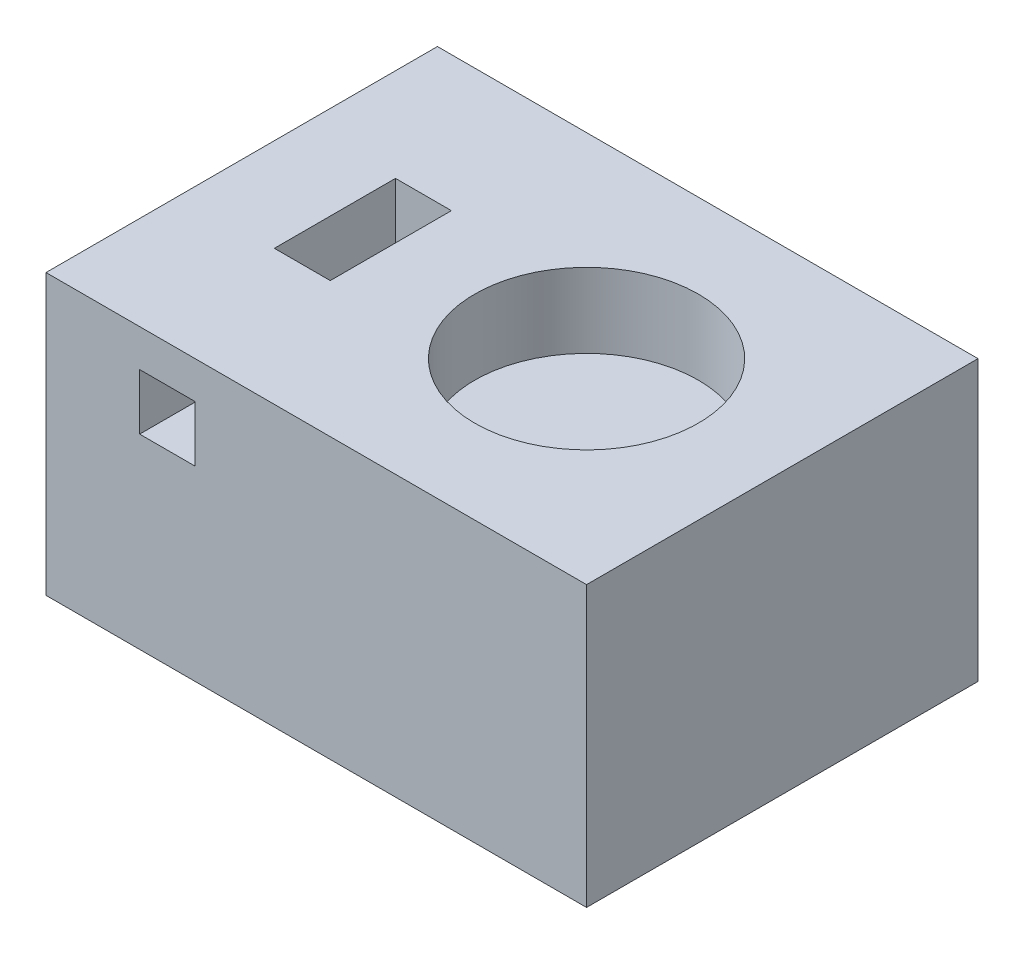
ISO-10303-21;
HEADER;
FILE_DESCRIPTION(('STEP AP214'),'2;1');
FILE_NAME('part.step','',(''),(''),'','','');
FILE_SCHEMA(('AUTOMOTIVE_DESIGN { 1 0 10303 214 1 1 1 1 }'));
ENDSEC;
DATA;
#1=APPLICATION_CONTEXT('core data for automotive mechanical design processes');
#2=APPLICATION_PROTOCOL_DEFINITION('international standard','automotive_design',2000,#1);
#3=PRODUCT_CONTEXT('',#1,'mechanical');
#4=PRODUCT('Part','Part','',(#3));
#5=PRODUCT_RELATED_PRODUCT_CATEGORY('part','',(#4));
#6=PRODUCT_DEFINITION_FORMATION('','',#4);
#7=PRODUCT_DEFINITION_CONTEXT('part definition',#1,'design');
#8=PRODUCT_DEFINITION('design','',#6,#7);
#9=PRODUCT_DEFINITION_SHAPE('','',#8);
#10=(LENGTH_UNIT() NAMED_UNIT(*) SI_UNIT(.MILLI.,.METRE.));
#11=(NAMED_UNIT(*) PLANE_ANGLE_UNIT() SI_UNIT($,.RADIAN.));
#12=(NAMED_UNIT(*) SI_UNIT($,.STERADIAN.) SOLID_ANGLE_UNIT());
#13=UNCERTAINTY_MEASURE_WITH_UNIT(LENGTH_MEASURE(1.E-05),#10,'distance_accuracy_value','');
#14=(GEOMETRIC_REPRESENTATION_CONTEXT(3) GLOBAL_UNCERTAINTY_ASSIGNED_CONTEXT((#13)) GLOBAL_UNIT_ASSIGNED_CONTEXT((#10,
#11,#12)) REPRESENTATION_CONTEXT('',''));
#15=CARTESIAN_POINT('',(0.,0.,0.));
#16=DIRECTION('',(0.,0.,1.));
#17=DIRECTION('',(1.,0.,0.));
#18=AXIS2_PLACEMENT_3D('',#15,#16,#17);
#19=CARTESIAN_POINT('',(-21.,30.,21.));
#20=DIRECTION('',(0.,0.,-1.));
#21=DIRECTION('',(-1.,0.,0.));
#22=AXIS2_PLACEMENT_3D('',#19,#20,#21);
#23=PLANE('',#22);
#24=DIRECTION('',(1.,0.,0.));
#25=VECTOR('',#24,1.);
#26=CARTESIAN_POINT('',(-21.,0.,21.));
#27=LINE('',#26,#25);
#28=CARTESIAN_POINT('',(-37.,0.,21.));
#29=VERTEX_POINT('',#28);
#30=CARTESIAN_POINT('',(21.,0.,21.));
#31=VERTEX_POINT('',#30);
#32=EDGE_CURVE('E209',#29,#31,#27,.T.);
#33=ORIENTED_EDGE('',*,*,#32,.T.);
#34=DIRECTION('',(0.,-1.,0.));
#35=VECTOR('',#34,1.);
#36=CARTESIAN_POINT('',(21.,30.,21.));
#37=LINE('',#36,#35);
#38=CARTESIAN_POINT('',(21.,30.,21.));
#39=VERTEX_POINT('',#38);
#40=EDGE_CURVE('E213',#39,#31,#37,.T.);
#41=ORIENTED_EDGE('',*,*,#40,.F.);
#42=DIRECTION('',(1.,0.,0.));
#43=VECTOR('',#42,1.);
#44=CARTESIAN_POINT('',(-21.,30.,21.));
#45=LINE('',#44,#43);
#46=CARTESIAN_POINT('',(-37.,30.,21.));
#47=VERTEX_POINT('',#46);
#48=EDGE_CURVE('E211',#47,#39,#45,.T.);
#49=ORIENTED_EDGE('',*,*,#48,.F.);
#50=DIRECTION('',(0.,1.,0.));
#51=VECTOR('',#50,1.);
#52=CARTESIAN_POINT('',(-37.,30.,21.));
#53=LINE('',#52,#51);
#54=EDGE_CURVE('E192',#29,#47,#53,.T.);
#55=ORIENTED_EDGE('',*,*,#54,.F.);
#56=EDGE_LOOP('',(#33,#41,#49,#55));
#57=FACE_BOUND('',#56,.T.);
#58=DIRECTION('',(0.,-1.,0.));
#59=VECTOR('',#58,1.);
#60=CARTESIAN_POINT('',(-26.9493798110874,20.00915587614,21.));
#61=LINE('',#60,#59);
#62=CARTESIAN_POINT('',(-26.9493798110874,26.00915587614,21.));
#63=VERTEX_POINT('',#62);
#64=CARTESIAN_POINT('',(-26.9493798110874,20.00915587614,21.));
#65=VERTEX_POINT('',#64);
#66=EDGE_CURVE('E126',#63,#65,#61,.T.);
#67=ORIENTED_EDGE('',*,*,#66,.F.);
#68=DIRECTION('',(-1.,0.,0.));
#69=VECTOR('',#68,1.);
#70=CARTESIAN_POINT('',(-26.9493798110874,26.00915587614,21.));
#71=LINE('',#70,#69);
#72=CARTESIAN_POINT('',(-21.,26.00915587614,21.));
#73=VERTEX_POINT('',#72);
#74=EDGE_CURVE('E146',#73,#63,#71,.T.);
#75=ORIENTED_EDGE('',*,*,#74,.F.);
#76=DIRECTION('',(0.,1.,0.));
#77=VECTOR('',#76,1.);
#78=CARTESIAN_POINT('',(-21.,20.00915587614,21.));
#79=LINE('',#78,#77);
#80=CARTESIAN_POINT('',(-21.,20.00915587614,21.));
#81=VERTEX_POINT('',#80);
#82=EDGE_CURVE('E144',#81,#73,#79,.T.);
#83=ORIENTED_EDGE('',*,*,#82,.F.);
#84=DIRECTION('',(1.,0.,0.));
#85=VECTOR('',#84,1.);
#86=CARTESIAN_POINT('',(-26.9493798110874,20.00915587614,21.));
#87=LINE('',#86,#85);
#88=EDGE_CURVE('E134',#65,#81,#87,.T.);
#89=ORIENTED_EDGE('',*,*,#88,.F.);
#90=EDGE_LOOP('',(#67,#75,#83,#89));
#91=FACE_BOUND('',#90,.T.);
#92=ADVANCED_FACE('F39',(#57,#91),#23,.F.);
#93=CARTESIAN_POINT('',(-27.,19.,6.5));
#94=DIRECTION('',(0.,0.,1.));
#95=DIRECTION('',(1.,0.,0.));
#96=AXIS2_PLACEMENT_3D('',#93,#94,#95);
#97=PLANE('',#96);
#98=DIRECTION('',(-1.,0.,0.));
#99=VECTOR('',#98,1.);
#100=CARTESIAN_POINT('',(-27.,20.00915587614,6.5));
#101=LINE('',#100,#99);
#102=CARTESIAN_POINT('',(-21.,20.00915587614,6.5));
#103=VERTEX_POINT('',#102);
#104=CARTESIAN_POINT('',(-26.9493798110874,20.00915587614,6.5));
#105=VERTEX_POINT('',#104);
#106=EDGE_CURVE('E11',#103,#105,#101,.T.);
#107=ORIENTED_EDGE('',*,*,#106,.F.);
#108=DIRECTION('',(0.,1.,0.));
#109=VECTOR('',#108,1.);
#110=CARTESIAN_POINT('',(-21.,19.,6.5));
#111=LINE('',#110,#109);
#112=CARTESIAN_POINT('',(-21.,19.,6.5));
#113=VERTEX_POINT('',#112);
#114=EDGE_CURVE('E181',#113,#103,#111,.T.);
#115=ORIENTED_EDGE('',*,*,#114,.F.);
#116=DIRECTION('',(1.,0.,0.));
#117=VECTOR('',#116,1.);
#118=CARTESIAN_POINT('',(-27.,19.,6.5));
#119=LINE('',#118,#117);
#120=CARTESIAN_POINT('',(-27.,19.,6.5));
#121=VERTEX_POINT('',#120);
#122=EDGE_CURVE('E156',#121,#113,#119,.T.);
#123=ORIENTED_EDGE('',*,*,#122,.F.);
#124=DIRECTION('',(0.,1.,0.));
#125=VECTOR('',#124,1.);
#126=CARTESIAN_POINT('',(-27.,19.,6.5));
#127=LINE('',#126,#125);
#128=CARTESIAN_POINT('',(-27.,30.,6.5));
#129=VERTEX_POINT('',#128);
#130=EDGE_CURVE('E166',#121,#129,#127,.T.);
#131=ORIENTED_EDGE('',*,*,#130,.T.);
#132=DIRECTION('',(1.,0.,0.));
#133=VECTOR('',#132,1.);
#134=CARTESIAN_POINT('',(-27.,30.,6.5));
#135=LINE('',#134,#133);
#136=CARTESIAN_POINT('',(-21.,30.,6.5));
#137=VERTEX_POINT('',#136);
#138=EDGE_CURVE('E168',#129,#137,#135,.T.);
#139=ORIENTED_EDGE('',*,*,#138,.T.);
#140=CARTESIAN_POINT('',(-21.,26.00915587614,6.5));
#141=VERTEX_POINT('',#140);
#142=EDGE_CURVE('E184',#141,#137,#111,.T.);
#143=ORIENTED_EDGE('',*,*,#142,.F.);
#144=DIRECTION('',(1.,0.,0.));
#145=VECTOR('',#144,1.);
#146=CARTESIAN_POINT('',(-27.,26.00915587614,6.5));
#147=LINE('',#146,#145);
#148=CARTESIAN_POINT('',(-26.9493798110874,26.00915587614,6.5));
#149=VERTEX_POINT('',#148);
#150=EDGE_CURVE('E224',#149,#141,#147,.T.);
#151=ORIENTED_EDGE('',*,*,#150,.F.);
#152=DIRECTION('',(0.,1.,0.));
#153=VECTOR('',#152,1.);
#154=CARTESIAN_POINT('',(-26.9493798110874,19.,6.5));
#155=LINE('',#154,#153);
#156=EDGE_CURVE('E47',#105,#149,#155,.T.);
#157=ORIENTED_EDGE('',*,*,#156,.F.);
#158=EDGE_LOOP('',(#107,#115,#123,#131,#139,#143,#151,#157));
#159=FACE_BOUND('',#158,.T.);
#160=ADVANCED_FACE('F228',(#159),#97,.F.);
#161=CARTESIAN_POINT('',(21.,30.,-21.));
#162=DIRECTION('',(-1.,0.,0.));
#163=DIRECTION('',(0.,0.,1.));
#164=AXIS2_PLACEMENT_3D('',#161,#162,#163);
#165=PLANE('',#164);
#166=DIRECTION('',(0.,0.,-1.));
#167=VECTOR('',#166,1.);
#168=CARTESIAN_POINT('',(21.,0.,-21.));
#169=LINE('',#168,#167);
#170=CARTESIAN_POINT('',(21.,0.,-21.));
#171=VERTEX_POINT('',#170);
#172=EDGE_CURVE('E202',#31,#171,#169,.T.);
#173=ORIENTED_EDGE('',*,*,#172,.T.);
#174=DIRECTION('',(0.,-1.,0.));
#175=VECTOR('',#174,1.);
#176=CARTESIAN_POINT('',(21.,30.,-21.));
#177=LINE('',#176,#175);
#178=CARTESIAN_POINT('',(21.,30.,-21.));
#179=VERTEX_POINT('',#178);
#180=EDGE_CURVE('E221',#179,#171,#177,.T.);
#181=ORIENTED_EDGE('',*,*,#180,.F.);
#182=DIRECTION('',(0.,0.,-1.));
#183=VECTOR('',#182,1.);
#184=CARTESIAN_POINT('',(21.,30.,-21.));
#185=LINE('',#184,#183);
#186=EDGE_CURVE('E205',#39,#179,#185,.T.);
#187=ORIENTED_EDGE('',*,*,#186,.F.);
#188=ORIENTED_EDGE('',*,*,#40,.T.);
#189=EDGE_LOOP('',(#173,#181,#187,#188));
#190=FACE_BOUND('',#189,.T.);
#191=ADVANCED_FACE('F41',(#190),#165,.F.);
#192=CARTESIAN_POINT('',(-21.,30.,-21.));
#193=DIRECTION('',(0.,0.,1.));
#194=DIRECTION('',(1.,0.,0.));
#195=AXIS2_PLACEMENT_3D('',#192,#193,#194);
#196=PLANE('',#195);
#197=DIRECTION('',(-1.,0.,0.));
#198=VECTOR('',#197,1.);
#199=CARTESIAN_POINT('',(-21.,0.,-21.));
#200=LINE('',#199,#198);
#201=CARTESIAN_POINT('',(-37.,0.,-21.));
#202=VERTEX_POINT('',#201);
#203=EDGE_CURVE('E216',#171,#202,#200,.T.);
#204=ORIENTED_EDGE('',*,*,#203,.T.);
#205=DIRECTION('',(0.,-1.,0.));
#206=VECTOR('',#205,1.);
#207=CARTESIAN_POINT('',(-37.,30.,-21.));
#208=LINE('',#207,#206);
#209=CARTESIAN_POINT('',(-37.,30.,-21.));
#210=VERTEX_POINT('',#209);
#211=EDGE_CURVE('E178',#210,#202,#208,.T.);
#212=ORIENTED_EDGE('',*,*,#211,.F.);
#213=DIRECTION('',(-1.,0.,0.));
#214=VECTOR('',#213,1.);
#215=CARTESIAN_POINT('',(-21.,30.,-21.));
#216=LINE('',#215,#214);
#217=EDGE_CURVE('E208',#179,#210,#216,.T.);
#218=ORIENTED_EDGE('',*,*,#217,.F.);
#219=ORIENTED_EDGE('',*,*,#180,.T.);
#220=EDGE_LOOP('',(#204,#212,#218,#219));
#221=FACE_BOUND('',#220,.T.);
#222=ADVANCED_FACE('F269',(#221),#196,.F.);
#223=CARTESIAN_POINT('',(0.,30.,0.));
#224=DIRECTION('',(0.,1.,0.));
#225=DIRECTION('',(0.,0.,1.));
#226=AXIS2_PLACEMENT_3D('',#223,#224,#225);
#227=PLANE('',#226);
#228=DIRECTION('',(0.,0.,1.));
#229=VECTOR('',#228,1.);
#230=CARTESIAN_POINT('',(-27.,30.,-6.5));
#231=LINE('',#230,#229);
#232=CARTESIAN_POINT('',(-27.,30.,-6.5));
#233=VERTEX_POINT('',#232);
#234=EDGE_CURVE('E140',#233,#129,#231,.T.);
#235=ORIENTED_EDGE('',*,*,#234,.F.);
#236=DIRECTION('',(-1.,0.,0.));
#237=VECTOR('',#236,1.);
#238=CARTESIAN_POINT('',(-27.,30.,-6.5));
#239=LINE('',#238,#237);
#240=CARTESIAN_POINT('',(-21.,30.,-6.5));
#241=VERTEX_POINT('',#240);
#242=EDGE_CURVE('E157',#241,#233,#239,.T.);
#243=ORIENTED_EDGE('',*,*,#242,.F.);
#244=DIRECTION('',(0.,0.,-1.));
#245=VECTOR('',#244,1.);
#246=CARTESIAN_POINT('',(-21.,30.,-6.5));
#247=LINE('',#246,#245);
#248=EDGE_CURVE('E171',#137,#241,#247,.T.);
#249=ORIENTED_EDGE('',*,*,#248,.F.);
#250=ORIENTED_EDGE('',*,*,#138,.F.);
#251=EDGE_LOOP('',(#235,#243,#249,#250));
#252=FACE_BOUND('',#251,.T.);
#253=CARTESIAN_POINT('',(0.,30.,0.));
#254=DIRECTION('',(0.,1.,0.));
#255=DIRECTION('',(0.,0.,1.));
#256=AXIS2_PLACEMENT_3D('',#253,#254,#255);
#257=CIRCLE('',#256,12.);
#258=CARTESIAN_POINT('',(0.,30.,12.));
#259=VERTEX_POINT('',#258);
#260=EDGE_CURVE('E198',#259,#259,#257,.T.);
#261=ORIENTED_EDGE('',*,*,#260,.F.);
#262=EDGE_LOOP('',(#261));
#263=FACE_BOUND('',#262,.T.);
#264=ORIENTED_EDGE('',*,*,#186,.T.);
#265=ORIENTED_EDGE('',*,*,#217,.T.);
#266=DIRECTION('',(0.,0.,-1.));
#267=VECTOR('',#266,1.);
#268=CARTESIAN_POINT('',(-37.,30.,-21.));
#269=LINE('',#268,#267);
#270=EDGE_CURVE('E195',#47,#210,#269,.T.);
#271=ORIENTED_EDGE('',*,*,#270,.F.);
#272=ORIENTED_EDGE('',*,*,#48,.T.);
#273=EDGE_LOOP('',(#264,#265,#271,#272));
#274=FACE_BOUND('',#273,.T.);
#275=ADVANCED_FACE('F244',(#252,#263,#274),#227,.T.);
#276=CARTESIAN_POINT('',(0.,0.,0.));
#277=DIRECTION('',(0.,1.,0.));
#278=DIRECTION('',(0.,0.,1.));
#279=AXIS2_PLACEMENT_3D('',#276,#277,#278);
#280=PLANE('',#279);
#281=ORIENTED_EDGE('',*,*,#172,.F.);
#282=ORIENTED_EDGE('',*,*,#32,.F.);
#283=DIRECTION('',(0.,0.,1.));
#284=VECTOR('',#283,1.);
#285=CARTESIAN_POINT('',(-37.,0.,-21.));
#286=LINE('',#285,#284);
#287=EDGE_CURVE('E189',#202,#29,#286,.T.);
#288=ORIENTED_EDGE('',*,*,#287,.F.);
#289=ORIENTED_EDGE('',*,*,#203,.F.);
#290=EDGE_LOOP('',(#281,#282,#288,#289));
#291=FACE_BOUND('',#290,.T.);
#292=ADVANCED_FACE('F267',(#291),#280,.F.);
#293=CARTESIAN_POINT('',(0.,22.,0.));
#294=DIRECTION('',(0.,1.,0.));
#295=DIRECTION('',(0.,0.,1.));
#296=AXIS2_PLACEMENT_3D('',#293,#294,#295);
#297=CYLINDRICAL_SURFACE('',#296,12.);
#298=CARTESIAN_POINT('',(0.,22.,0.));
#299=DIRECTION('',(0.,1.,0.));
#300=DIRECTION('',(0.,0.,1.));
#301=AXIS2_PLACEMENT_3D('',#298,#299,#300);
#302=CIRCLE('',#301,12.);
#303=CARTESIAN_POINT('',(0.,22.,12.));
#304=VERTEX_POINT('',#303);
#305=EDGE_CURVE('E199',#304,#304,#302,.T.);
#306=ORIENTED_EDGE('',*,*,#305,.F.);
#307=EDGE_LOOP('',(#306));
#308=FACE_BOUND('',#307,.T.);
#309=ORIENTED_EDGE('',*,*,#260,.T.);
#310=EDGE_LOOP('',(#309));
#311=FACE_BOUND('',#310,.T.);
#312=ADVANCED_FACE('F294',(#308,#311),#297,.F.);
#313=CARTESIAN_POINT('',(0.,22.,0.));
#314=DIRECTION('',(0.,1.,0.));
#315=DIRECTION('',(0.,0.,1.));
#316=AXIS2_PLACEMENT_3D('',#313,#314,#315);
#317=PLANE('',#316);
#318=ORIENTED_EDGE('',*,*,#305,.T.);
#319=EDGE_LOOP('',(#318));
#320=FACE_BOUND('',#319,.T.);
#321=ADVANCED_FACE('F289',(#320),#317,.T.);
#322=CARTESIAN_POINT('',(-37.,0.,0.));
#323=DIRECTION('',(-1.,0.,0.));
#324=DIRECTION('',(0.,0.,1.));
#325=AXIS2_PLACEMENT_3D('',#322,#323,#324);
#326=PLANE('',#325);
#327=ORIENTED_EDGE('',*,*,#211,.T.);
#328=ORIENTED_EDGE('',*,*,#287,.T.);
#329=ORIENTED_EDGE('',*,*,#54,.T.);
#330=ORIENTED_EDGE('',*,*,#270,.T.);
#331=EDGE_LOOP('',(#327,#328,#329,#330));
#332=FACE_BOUND('',#331,.T.);
#333=ADVANCED_FACE('F256',(#332),#326,.T.);
#334=CARTESIAN_POINT('',(-27.,19.,-6.5));
#335=DIRECTION('',(-1.,0.,0.));
#336=DIRECTION('',(0.,0.,1.));
#337=AXIS2_PLACEMENT_3D('',#334,#335,#336);
#338=PLANE('',#337);
#339=ORIENTED_EDGE('',*,*,#234,.T.);
#340=ORIENTED_EDGE('',*,*,#130,.F.);
#341=DIRECTION('',(0.,0.,1.));
#342=VECTOR('',#341,1.);
#343=CARTESIAN_POINT('',(-27.,19.,-6.5));
#344=LINE('',#343,#342);
#345=CARTESIAN_POINT('',(-27.,19.,-6.5));
#346=VERTEX_POINT('',#345);
#347=EDGE_CURVE('E153',#346,#121,#344,.T.);
#348=ORIENTED_EDGE('',*,*,#347,.F.);
#349=DIRECTION('',(0.,1.,0.));
#350=VECTOR('',#349,1.);
#351=CARTESIAN_POINT('',(-27.,19.,-6.5));
#352=LINE('',#351,#350);
#353=EDGE_CURVE('E176',#346,#233,#352,.T.);
#354=ORIENTED_EDGE('',*,*,#353,.T.);
#355=EDGE_LOOP('',(#339,#340,#348,#354));
#356=FACE_BOUND('',#355,.T.);
#357=ADVANCED_FACE('F239',(#356),#338,.F.);
#358=CARTESIAN_POINT('',(-27.,19.,-6.5));
#359=DIRECTION('',(0.,0.,-1.));
#360=DIRECTION('',(-1.,0.,0.));
#361=AXIS2_PLACEMENT_3D('',#358,#359,#360);
#362=PLANE('',#361);
#363=DIRECTION('',(0.,1.,0.));
#364=VECTOR('',#363,1.);
#365=CARTESIAN_POINT('',(-21.,19.,-6.5));
#366=LINE('',#365,#364);
#367=CARTESIAN_POINT('',(-21.,19.,-6.5));
#368=VERTEX_POINT('',#367);
#369=EDGE_CURVE('E179',#368,#241,#366,.T.);
#370=ORIENTED_EDGE('',*,*,#369,.T.);
#371=ORIENTED_EDGE('',*,*,#242,.T.);
#372=ORIENTED_EDGE('',*,*,#353,.F.);
#373=DIRECTION('',(-1.,0.,0.));
#374=VECTOR('',#373,1.);
#375=CARTESIAN_POINT('',(-27.,19.,-6.5));
#376=LINE('',#375,#374);
#377=EDGE_CURVE('E163',#368,#346,#376,.T.);
#378=ORIENTED_EDGE('',*,*,#377,.F.);
#379=EDGE_LOOP('',(#370,#371,#372,#378));
#380=FACE_BOUND('',#379,.T.);
#381=ADVANCED_FACE('F248',(#380),#362,.F.);
#382=CARTESIAN_POINT('',(-21.,19.,-6.5));
#383=DIRECTION('',(1.,0.,0.));
#384=DIRECTION('',(0.,0.,-1.));
#385=AXIS2_PLACEMENT_3D('',#382,#383,#384);
#386=PLANE('',#385);
#387=ORIENTED_EDGE('',*,*,#248,.T.);
#388=ORIENTED_EDGE('',*,*,#369,.F.);
#389=DIRECTION('',(0.,0.,-1.));
#390=VECTOR('',#389,1.);
#391=CARTESIAN_POINT('',(-21.,19.,-6.5));
#392=LINE('',#391,#390);
#393=EDGE_CURVE('E160',#113,#368,#392,.T.);
#394=ORIENTED_EDGE('',*,*,#393,.F.);
#395=ORIENTED_EDGE('',*,*,#114,.T.);
#396=DIRECTION('',(0.,0.,-1.));
#397=VECTOR('',#396,1.);
#398=CARTESIAN_POINT('',(-21.,20.00915587614,21.));
#399=LINE('',#398,#397);
#400=EDGE_CURVE('E141',#81,#103,#399,.T.);
#401=ORIENTED_EDGE('',*,*,#400,.F.);
#402=ORIENTED_EDGE('',*,*,#82,.T.);
#403=DIRECTION('',(0.,0.,-1.));
#404=VECTOR('',#403,1.);
#405=CARTESIAN_POINT('',(-21.,26.00915587614,21.));
#406=LINE('',#405,#404);
#407=EDGE_CURVE('E54',#73,#141,#406,.T.);
#408=ORIENTED_EDGE('',*,*,#407,.T.);
#409=ORIENTED_EDGE('',*,*,#142,.T.);
#410=EDGE_LOOP('',(#387,#388,#394,#395,#401,#402,#408,#409));
#411=FACE_BOUND('',#410,.T.);
#412=ADVANCED_FACE('F231',(#411),#386,.F.);
#413=CARTESIAN_POINT('',(0.,19.,0.));
#414=DIRECTION('',(0.,1.,0.));
#415=DIRECTION('',(0.,0.,1.));
#416=AXIS2_PLACEMENT_3D('',#413,#414,#415);
#417=PLANE('',#416);
#418=ORIENTED_EDGE('',*,*,#347,.T.);
#419=ORIENTED_EDGE('',*,*,#122,.T.);
#420=ORIENTED_EDGE('',*,*,#393,.T.);
#421=ORIENTED_EDGE('',*,*,#377,.T.);
#422=EDGE_LOOP('',(#418,#419,#420,#421));
#423=FACE_BOUND('',#422,.T.);
#424=ADVANCED_FACE('F236',(#423),#417,.T.);
#425=CARTESIAN_POINT('',(-26.9493798110874,20.00915587614,21.));
#426=DIRECTION('',(1.,0.,0.));
#427=DIRECTION('',(0.,0.,-1.));
#428=AXIS2_PLACEMENT_3D('',#425,#426,#427);
#429=PLANE('',#428);
#430=ORIENTED_EDGE('',*,*,#156,.T.);
#431=DIRECTION('',(0.,0.,-1.));
#432=VECTOR('',#431,1.);
#433=CARTESIAN_POINT('',(-26.9493798110874,26.00915587614,21.));
#434=LINE('',#433,#432);
#435=EDGE_CURVE('E59',#63,#149,#434,.T.);
#436=ORIENTED_EDGE('',*,*,#435,.F.);
#437=ORIENTED_EDGE('',*,*,#66,.T.);
#438=DIRECTION('',(0.,0.,-1.));
#439=VECTOR('',#438,1.);
#440=CARTESIAN_POINT('',(-26.9493798110874,20.00915587614,21.));
#441=LINE('',#440,#439);
#442=EDGE_CURVE('E129',#65,#105,#441,.T.);
#443=ORIENTED_EDGE('',*,*,#442,.T.);
#444=EDGE_LOOP('',(#430,#436,#437,#443));
#445=FACE_BOUND('',#444,.T.);
#446=ADVANCED_FACE('F128',(#445),#429,.T.);
#447=CARTESIAN_POINT('',(-26.9493798110874,20.00915587614,21.));
#448=DIRECTION('',(0.,1.,0.));
#449=DIRECTION('',(0.,0.,1.));
#450=AXIS2_PLACEMENT_3D('',#447,#448,#449);
#451=PLANE('',#450);
#452=ORIENTED_EDGE('',*,*,#106,.T.);
#453=ORIENTED_EDGE('',*,*,#442,.F.);
#454=ORIENTED_EDGE('',*,*,#88,.T.);
#455=ORIENTED_EDGE('',*,*,#400,.T.);
#456=EDGE_LOOP('',(#452,#453,#454,#455));
#457=FACE_BOUND('',#456,.T.);
#458=ADVANCED_FACE('F137',(#457),#451,.T.);
#459=CARTESIAN_POINT('',(-26.9493798110874,26.00915587614,21.));
#460=DIRECTION('',(0.,-1.,0.));
#461=DIRECTION('',(0.,0.,-1.));
#462=AXIS2_PLACEMENT_3D('',#459,#460,#461);
#463=PLANE('',#462);
#464=ORIENTED_EDGE('',*,*,#150,.T.);
#465=ORIENTED_EDGE('',*,*,#407,.F.);
#466=ORIENTED_EDGE('',*,*,#74,.T.);
#467=ORIENTED_EDGE('',*,*,#435,.T.);
#468=EDGE_LOOP('',(#464,#465,#466,#467));
#469=FACE_BOUND('',#468,.T.);
#470=ADVANCED_FACE('F229',(#469),#463,.T.);
#471=CLOSED_SHELL('',(#92,#160,#191,#222,#275,#292,#312,#321,#333,#357,#381,#412,#424,#446,#458,#470));
#472=MANIFOLD_SOLID_BREP('B2',#471);
#473=ADVANCED_BREP_SHAPE_REPRESENTATION('',(#18,#472),#14);
#474=SHAPE_DEFINITION_REPRESENTATION(#9,#473);
ENDSEC;
END-ISO-10303-21;
